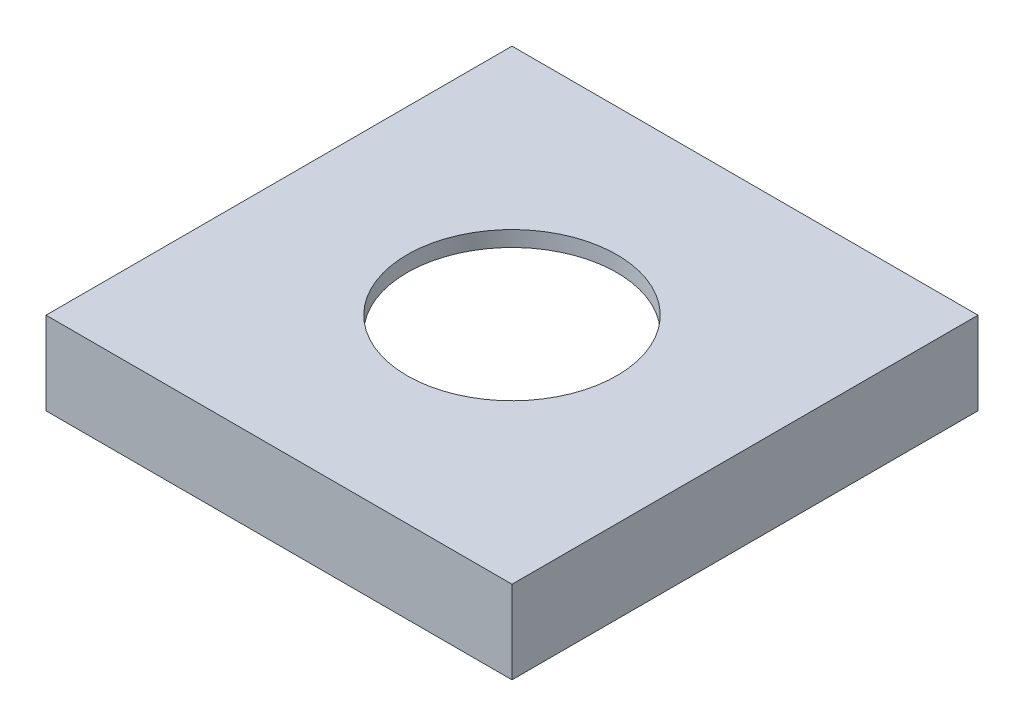
ISO-10303-21;
HEADER;
FILE_DESCRIPTION(('STEP AP214'),'2;1');
FILE_NAME('part.step','',(''),(''),'','','');
FILE_SCHEMA(('AUTOMOTIVE_DESIGN { 1 0 10303 214 1 1 1 1 }'));
ENDSEC;
DATA;
#1=APPLICATION_CONTEXT('core data for automotive mechanical design processes');
#2=APPLICATION_PROTOCOL_DEFINITION('international standard','automotive_design',2000,#1);
#3=PRODUCT_CONTEXT('',#1,'mechanical');
#4=PRODUCT('Part','Part','',(#3));
#5=PRODUCT_RELATED_PRODUCT_CATEGORY('part','',(#4));
#6=PRODUCT_DEFINITION_FORMATION('','',#4);
#7=PRODUCT_DEFINITION_CONTEXT('part definition',#1,'design');
#8=PRODUCT_DEFINITION('design','',#6,#7);
#9=PRODUCT_DEFINITION_SHAPE('','',#8);
#10=(LENGTH_UNIT() NAMED_UNIT(*) SI_UNIT(.MILLI.,.METRE.));
#11=(NAMED_UNIT(*) PLANE_ANGLE_UNIT() SI_UNIT($,.RADIAN.));
#12=(NAMED_UNIT(*) SI_UNIT($,.STERADIAN.) SOLID_ANGLE_UNIT());
#13=UNCERTAINTY_MEASURE_WITH_UNIT(LENGTH_MEASURE(1.E-05),#10,'distance_accuracy_value','');
#14=(GEOMETRIC_REPRESENTATION_CONTEXT(3) GLOBAL_UNCERTAINTY_ASSIGNED_CONTEXT((#13)) GLOBAL_UNIT_ASSIGNED_CONTEXT((#10,
#11,#12)) REPRESENTATION_CONTEXT('',''));
#15=CARTESIAN_POINT('',(0.,0.,0.));
#16=DIRECTION('',(0.,0.,1.));
#17=DIRECTION('',(1.,0.,0.));
#18=AXIS2_PLACEMENT_3D('',#15,#16,#17);
#19=CARTESIAN_POINT('',(0.,0.,0.));
#20=DIRECTION('',(0.,-1.,0.));
#21=DIRECTION('',(0.,0.,-1.));
#22=AXIS2_PLACEMENT_3D('',#19,#20,#21);
#23=PLANE('',#22);
#24=DIRECTION('',(-1.,0.,0.));
#25=VECTOR('',#24,1.);
#26=CARTESIAN_POINT('',(-18.,0.,-18.));
#27=LINE('',#26,#25);
#28=CARTESIAN_POINT('',(18.,0.,-18.));
#29=VERTEX_POINT('',#28);
#30=CARTESIAN_POINT('',(-18.,0.,-18.));
#31=VERTEX_POINT('',#30);
#32=EDGE_CURVE('E161',#29,#31,#27,.T.);
#33=ORIENTED_EDGE('',*,*,#32,.F.);
#34=DIRECTION('',(0.,0.,-1.));
#35=VECTOR('',#34,1.);
#36=CARTESIAN_POINT('',(18.,0.,-18.));
#37=LINE('',#36,#35);
#38=CARTESIAN_POINT('',(18.,0.,18.));
#39=VERTEX_POINT('',#38);
#40=EDGE_CURVE('E57',#39,#29,#37,.T.);
#41=ORIENTED_EDGE('',*,*,#40,.F.);
#42=DIRECTION('',(1.,0.,0.));
#43=VECTOR('',#42,1.);
#44=CARTESIAN_POINT('',(-18.,0.,18.));
#45=LINE('',#44,#43);
#46=CARTESIAN_POINT('',(-18.,0.,18.));
#47=VERTEX_POINT('',#46);
#48=EDGE_CURVE('E165',#47,#39,#45,.T.);
#49=ORIENTED_EDGE('',*,*,#48,.F.);
#50=DIRECTION('',(0.,0.,1.));
#51=VECTOR('',#50,1.);
#52=CARTESIAN_POINT('',(-18.,0.,-18.));
#53=LINE('',#52,#51);
#54=EDGE_CURVE('E163',#31,#47,#53,.T.);
#55=ORIENTED_EDGE('',*,*,#54,.F.);
#56=EDGE_LOOP('',(#33,#41,#49,#55));
#57=FACE_BOUND('',#56,.T.);
#58=DIRECTION('',(1.,0.,0.));
#59=VECTOR('',#58,1.);
#60=CARTESIAN_POINT('',(-15.6,0.,15.6));
#61=LINE('',#60,#59);
#62=CARTESIAN_POINT('',(-15.6,0.,15.6));
#63=VERTEX_POINT('',#62);
#64=CARTESIAN_POINT('',(15.6,0.,15.6));
#65=VERTEX_POINT('',#64);
#66=EDGE_CURVE('E135',#63,#65,#61,.T.);
#67=ORIENTED_EDGE('',*,*,#66,.T.);
#68=DIRECTION('',(0.,0.,-1.));
#69=VECTOR('',#68,1.);
#70=CARTESIAN_POINT('',(15.6,0.,-15.6));
#71=LINE('',#70,#69);
#72=CARTESIAN_POINT('',(15.6,0.,-15.6));
#73=VERTEX_POINT('',#72);
#74=EDGE_CURVE('E49',#65,#73,#71,.T.);
#75=ORIENTED_EDGE('',*,*,#74,.T.);
#76=DIRECTION('',(-1.,0.,0.));
#77=VECTOR('',#76,1.);
#78=CARTESIAN_POINT('',(-15.6,0.,-15.6));
#79=LINE('',#78,#77);
#80=CARTESIAN_POINT('',(-15.6,0.,-15.6));
#81=VERTEX_POINT('',#80);
#82=EDGE_CURVE('E146',#73,#81,#79,.T.);
#83=ORIENTED_EDGE('',*,*,#82,.T.);
#84=DIRECTION('',(0.,0.,1.));
#85=VECTOR('',#84,1.);
#86=CARTESIAN_POINT('',(-15.6,0.,-15.6));
#87=LINE('',#86,#85);
#88=EDGE_CURVE('E149',#81,#63,#87,.T.);
#89=ORIENTED_EDGE('',*,*,#88,.T.);
#90=EDGE_LOOP('',(#67,#75,#83,#89));
#91=FACE_BOUND('',#90,.T.);
#92=ADVANCED_FACE('F34',(#57,#91),#23,.T.);
#93=CARTESIAN_POINT('',(-18.,5.2,-18.));
#94=DIRECTION('',(0.,0.,1.));
#95=DIRECTION('',(1.,0.,0.));
#96=AXIS2_PLACEMENT_3D('',#93,#94,#95);
#97=PLANE('',#96);
#98=ORIENTED_EDGE('',*,*,#32,.T.);
#99=DIRECTION('',(0.,-1.,0.));
#100=VECTOR('',#99,1.);
#101=CARTESIAN_POINT('',(-18.,5.2,-18.));
#102=LINE('',#101,#100);
#103=CARTESIAN_POINT('',(-18.,6.4,-18.));
#104=VERTEX_POINT('',#103);
#105=EDGE_CURVE('E11',#104,#31,#102,.T.);
#106=ORIENTED_EDGE('',*,*,#105,.F.);
#107=DIRECTION('',(-1.,0.,0.));
#108=VECTOR('',#107,1.);
#109=CARTESIAN_POINT('',(18.,6.4,-18.));
#110=LINE('',#109,#108);
#111=CARTESIAN_POINT('',(18.,6.4,-18.));
#112=VERTEX_POINT('',#111);
#113=EDGE_CURVE('E111',#112,#104,#110,.T.);
#114=ORIENTED_EDGE('',*,*,#113,.F.);
#115=DIRECTION('',(0.,-1.,0.));
#116=VECTOR('',#115,1.);
#117=CARTESIAN_POINT('',(18.,5.2,-18.));
#118=LINE('',#117,#116);
#119=EDGE_CURVE('E100',#112,#29,#118,.T.);
#120=ORIENTED_EDGE('',*,*,#119,.T.);
#121=EDGE_LOOP('',(#98,#106,#114,#120));
#122=FACE_BOUND('',#121,.T.);
#123=ADVANCED_FACE('F36',(#122),#97,.F.);
#124=CARTESIAN_POINT('',(-18.,5.2,-18.));
#125=DIRECTION('',(1.,0.,0.));
#126=DIRECTION('',(0.,0.,-1.));
#127=AXIS2_PLACEMENT_3D('',#124,#125,#126);
#128=PLANE('',#127);
#129=ORIENTED_EDGE('',*,*,#54,.T.);
#130=DIRECTION('',(0.,-1.,0.));
#131=VECTOR('',#130,1.);
#132=CARTESIAN_POINT('',(-18.,5.2,18.));
#133=LINE('',#132,#131);
#134=CARTESIAN_POINT('',(-18.,6.4,18.));
#135=VERTEX_POINT('',#134);
#136=EDGE_CURVE('E42',#135,#47,#133,.T.);
#137=ORIENTED_EDGE('',*,*,#136,.F.);
#138=DIRECTION('',(0.,0.,1.));
#139=VECTOR('',#138,1.);
#140=CARTESIAN_POINT('',(-18.,6.4,-18.));
#141=LINE('',#140,#139);
#142=EDGE_CURVE('E115',#104,#135,#141,.T.);
#143=ORIENTED_EDGE('',*,*,#142,.F.);
#144=ORIENTED_EDGE('',*,*,#105,.T.);
#145=EDGE_LOOP('',(#129,#137,#143,#144));
#146=FACE_BOUND('',#145,.T.);
#147=ADVANCED_FACE('F175',(#146),#128,.F.);
#148=CARTESIAN_POINT('',(-18.,5.2,18.));
#149=DIRECTION('',(0.,0.,-1.));
#150=DIRECTION('',(-1.,0.,0.));
#151=AXIS2_PLACEMENT_3D('',#148,#149,#150);
#152=PLANE('',#151);
#153=ORIENTED_EDGE('',*,*,#48,.T.);
#154=DIRECTION('',(0.,-1.,0.));
#155=VECTOR('',#154,1.);
#156=CARTESIAN_POINT('',(18.,5.2,18.));
#157=LINE('',#156,#155);
#158=CARTESIAN_POINT('',(18.,6.4,18.));
#159=VERTEX_POINT('',#158);
#160=EDGE_CURVE('E108',#159,#39,#157,.T.);
#161=ORIENTED_EDGE('',*,*,#160,.F.);
#162=DIRECTION('',(1.,0.,0.));
#163=VECTOR('',#162,1.);
#164=CARTESIAN_POINT('',(-18.,6.4,18.));
#165=LINE('',#164,#163);
#166=EDGE_CURVE('E121',#135,#159,#165,.T.);
#167=ORIENTED_EDGE('',*,*,#166,.F.);
#168=ORIENTED_EDGE('',*,*,#136,.T.);
#169=EDGE_LOOP('',(#153,#161,#167,#168));
#170=FACE_BOUND('',#169,.T.);
#171=ADVANCED_FACE('F171',(#170),#152,.F.);
#172=CARTESIAN_POINT('',(18.,5.2,-18.));
#173=DIRECTION('',(-1.,0.,0.));
#174=DIRECTION('',(0.,0.,1.));
#175=AXIS2_PLACEMENT_3D('',#172,#173,#174);
#176=PLANE('',#175);
#177=ORIENTED_EDGE('',*,*,#40,.T.);
#178=ORIENTED_EDGE('',*,*,#119,.F.);
#179=DIRECTION('',(0.,0.,-1.));
#180=VECTOR('',#179,1.);
#181=CARTESIAN_POINT('',(18.,6.4,18.));
#182=LINE('',#181,#180);
#183=EDGE_CURVE('E104',#159,#112,#182,.T.);
#184=ORIENTED_EDGE('',*,*,#183,.F.);
#185=ORIENTED_EDGE('',*,*,#160,.T.);
#186=EDGE_LOOP('',(#177,#178,#184,#185));
#187=FACE_BOUND('',#186,.T.);
#188=ADVANCED_FACE('F102',(#187),#176,.F.);
#189=CARTESIAN_POINT('',(15.6,5.2,-15.6));
#190=DIRECTION('',(-1.,0.,0.));
#191=DIRECTION('',(0.,0.,1.));
#192=AXIS2_PLACEMENT_3D('',#189,#190,#191);
#193=PLANE('',#192);
#194=ORIENTED_EDGE('',*,*,#74,.F.);
#195=DIRECTION('',(0.,-1.,0.));
#196=VECTOR('',#195,1.);
#197=CARTESIAN_POINT('',(15.6,5.2,15.6));
#198=LINE('',#197,#196);
#199=CARTESIAN_POINT('',(15.6,5.2,15.6));
#200=VERTEX_POINT('',#199);
#201=EDGE_CURVE('E144',#200,#65,#198,.T.);
#202=ORIENTED_EDGE('',*,*,#201,.F.);
#203=DIRECTION('',(0.,0.,-1.));
#204=VECTOR('',#203,1.);
#205=CARTESIAN_POINT('',(15.6,5.2,-15.6));
#206=LINE('',#205,#204);
#207=CARTESIAN_POINT('',(15.6,5.2,-15.6));
#208=VERTEX_POINT('',#207);
#209=EDGE_CURVE('E131',#200,#208,#206,.T.);
#210=ORIENTED_EDGE('',*,*,#209,.T.);
#211=DIRECTION('',(0.,-1.,0.));
#212=VECTOR('',#211,1.);
#213=CARTESIAN_POINT('',(15.6,5.2,-15.6));
#214=LINE('',#213,#212);
#215=EDGE_CURVE('E159',#208,#73,#214,.T.);
#216=ORIENTED_EDGE('',*,*,#215,.T.);
#217=EDGE_LOOP('',(#194,#202,#210,#216));
#218=FACE_BOUND('',#217,.T.);
#219=ADVANCED_FACE('F188',(#218),#193,.T.);
#220=CARTESIAN_POINT('',(-15.6,5.2,-15.6));
#221=DIRECTION('',(0.,0.,1.));
#222=DIRECTION('',(1.,0.,0.));
#223=AXIS2_PLACEMENT_3D('',#220,#221,#222);
#224=PLANE('',#223);
#225=ORIENTED_EDGE('',*,*,#82,.F.);
#226=ORIENTED_EDGE('',*,*,#215,.F.);
#227=DIRECTION('',(-1.,0.,0.));
#228=VECTOR('',#227,1.);
#229=CARTESIAN_POINT('',(-15.6,5.2,-15.6));
#230=LINE('',#229,#228);
#231=CARTESIAN_POINT('',(-15.6,5.2,-15.6));
#232=VERTEX_POINT('',#231);
#233=EDGE_CURVE('E134',#208,#232,#230,.T.);
#234=ORIENTED_EDGE('',*,*,#233,.T.);
#235=DIRECTION('',(0.,-1.,0.));
#236=VECTOR('',#235,1.);
#237=CARTESIAN_POINT('',(-15.6,5.2,-15.6));
#238=LINE('',#237,#236);
#239=EDGE_CURVE('E157',#232,#81,#238,.T.);
#240=ORIENTED_EDGE('',*,*,#239,.T.);
#241=EDGE_LOOP('',(#225,#226,#234,#240));
#242=FACE_BOUND('',#241,.T.);
#243=ADVANCED_FACE('F194',(#242),#224,.T.);
#244=CARTESIAN_POINT('',(-15.6,5.2,-15.6));
#245=DIRECTION('',(1.,0.,0.));
#246=DIRECTION('',(0.,0.,-1.));
#247=AXIS2_PLACEMENT_3D('',#244,#245,#246);
#248=PLANE('',#247);
#249=ORIENTED_EDGE('',*,*,#88,.F.);
#250=ORIENTED_EDGE('',*,*,#239,.F.);
#251=DIRECTION('',(0.,0.,1.));
#252=VECTOR('',#251,1.);
#253=CARTESIAN_POINT('',(-15.6,5.2,-15.6));
#254=LINE('',#253,#252);
#255=CARTESIAN_POINT('',(-15.6,5.2,15.6));
#256=VERTEX_POINT('',#255);
#257=EDGE_CURVE('E138',#232,#256,#254,.T.);
#258=ORIENTED_EDGE('',*,*,#257,.T.);
#259=DIRECTION('',(0.,-1.,0.));
#260=VECTOR('',#259,1.);
#261=CARTESIAN_POINT('',(-15.6,5.2,15.6));
#262=LINE('',#261,#260);
#263=EDGE_CURVE('E155',#256,#63,#262,.T.);
#264=ORIENTED_EDGE('',*,*,#263,.T.);
#265=EDGE_LOOP('',(#249,#250,#258,#264));
#266=FACE_BOUND('',#265,.T.);
#267=ADVANCED_FACE('F198',(#266),#248,.T.);
#268=CARTESIAN_POINT('',(-15.6,5.2,15.6));
#269=DIRECTION('',(0.,0.,-1.));
#270=DIRECTION('',(-1.,0.,0.));
#271=AXIS2_PLACEMENT_3D('',#268,#269,#270);
#272=PLANE('',#271);
#273=ORIENTED_EDGE('',*,*,#66,.F.);
#274=ORIENTED_EDGE('',*,*,#263,.F.);
#275=DIRECTION('',(1.,0.,0.));
#276=VECTOR('',#275,1.);
#277=CARTESIAN_POINT('',(-15.6,5.2,15.6));
#278=LINE('',#277,#276);
#279=EDGE_CURVE('E141',#256,#200,#278,.T.);
#280=ORIENTED_EDGE('',*,*,#279,.T.);
#281=ORIENTED_EDGE('',*,*,#201,.T.);
#282=EDGE_LOOP('',(#273,#274,#280,#281));
#283=FACE_BOUND('',#282,.T.);
#284=ADVANCED_FACE('F203',(#283),#272,.T.);
#285=CARTESIAN_POINT('',(0.,6.4,0.));
#286=DIRECTION('',(0.,1.,0.));
#287=DIRECTION('',(0.,0.,1.));
#288=AXIS2_PLACEMENT_3D('',#285,#286,#287);
#289=PLANE('',#288);
#290=ORIENTED_EDGE('',*,*,#183,.T.);
#291=ORIENTED_EDGE('',*,*,#113,.T.);
#292=ORIENTED_EDGE('',*,*,#142,.T.);
#293=ORIENTED_EDGE('',*,*,#166,.T.);
#294=EDGE_LOOP('',(#290,#291,#292,#293));
#295=FACE_BOUND('',#294,.T.);
#296=CARTESIAN_POINT('',(0.,6.4,0.));
#297=DIRECTION('',(0.,1.,0.));
#298=DIRECTION('',(0.,0.,1.));
#299=AXIS2_PLACEMENT_3D('',#296,#297,#298);
#300=CIRCLE('',#299,8.1);
#301=CARTESIAN_POINT('',(0.,6.4,8.1));
#302=VERTEX_POINT('',#301);
#303=EDGE_CURVE('E125',#302,#302,#300,.T.);
#304=ORIENTED_EDGE('',*,*,#303,.F.);
#305=EDGE_LOOP('',(#304));
#306=FACE_BOUND('',#305,.T.);
#307=ADVANCED_FACE('F118',(#295,#306),#289,.T.);
#308=CARTESIAN_POINT('',(0.,5.2,0.));
#309=DIRECTION('',(0.,1.,0.));
#310=DIRECTION('',(0.,0.,1.));
#311=AXIS2_PLACEMENT_3D('',#308,#309,#310);
#312=PLANE('',#311);
#313=ORIENTED_EDGE('',*,*,#209,.F.);
#314=ORIENTED_EDGE('',*,*,#279,.F.);
#315=ORIENTED_EDGE('',*,*,#257,.F.);
#316=ORIENTED_EDGE('',*,*,#233,.F.);
#317=EDGE_LOOP('',(#313,#314,#315,#316));
#318=FACE_BOUND('',#317,.T.);
#319=CARTESIAN_POINT('',(0.,5.2,0.));
#320=DIRECTION('',(0.,1.,0.));
#321=DIRECTION('',(0.,0.,1.));
#322=AXIS2_PLACEMENT_3D('',#319,#320,#321);
#323=CIRCLE('',#322,8.1);
#324=CARTESIAN_POINT('',(0.,5.2,8.1));
#325=VERTEX_POINT('',#324);
#326=EDGE_CURVE('E122',#325,#325,#323,.F.);
#327=ORIENTED_EDGE('',*,*,#326,.F.);
#328=EDGE_LOOP('',(#327));
#329=FACE_BOUND('',#328,.T.);
#330=ADVANCED_FACE('F210',(#318,#329),#312,.F.);
#331=CARTESIAN_POINT('',(0.,-25.3470129472589,0.));
#332=DIRECTION('',(0.,1.,0.));
#333=DIRECTION('',(0.,0.,1.));
#334=AXIS2_PLACEMENT_3D('',#331,#332,#333);
#335=CYLINDRICAL_SURFACE('',#334,8.1);
#336=ORIENTED_EDGE('',*,*,#326,.T.);
#337=EDGE_LOOP('',(#336));
#338=FACE_BOUND('',#337,.T.);
#339=ORIENTED_EDGE('',*,*,#303,.T.);
#340=EDGE_LOOP('',(#339));
#341=FACE_BOUND('',#340,.T.);
#342=ADVANCED_FACE('F213',(#338,#341),#335,.F.);
#343=CLOSED_SHELL('',(#92,#123,#147,#171,#188,#219,#243,#267,#284,#307,#330,#342));
#344=MANIFOLD_SOLID_BREP('B2',#343);
#345=ADVANCED_BREP_SHAPE_REPRESENTATION('',(#18,#344),#14);
#346=SHAPE_DEFINITION_REPRESENTATION(#9,#345);
ENDSEC;
END-ISO-10303-21;
